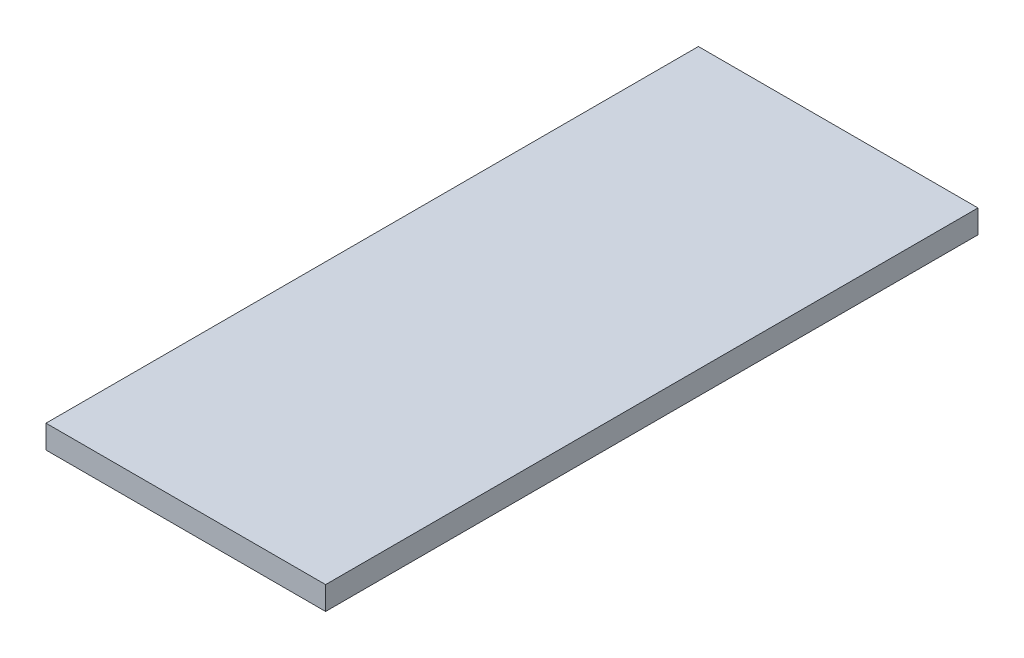
ISO-10303-21;
HEADER;
FILE_DESCRIPTION(('STEP AP214'),'2;1');
FILE_NAME('part.step','',(''),(''),'','','');
FILE_SCHEMA(('AUTOMOTIVE_DESIGN { 1 0 10303 214 1 1 1 1 }'));
ENDSEC;
DATA;
#1=APPLICATION_CONTEXT('core data for automotive mechanical design processes');
#2=APPLICATION_PROTOCOL_DEFINITION('international standard','automotive_design',2000,#1);
#3=PRODUCT_CONTEXT('',#1,'mechanical');
#4=PRODUCT('Part','Part','',(#3));
#5=PRODUCT_RELATED_PRODUCT_CATEGORY('part','',(#4));
#6=PRODUCT_DEFINITION_FORMATION('','',#4);
#7=PRODUCT_DEFINITION_CONTEXT('part definition',#1,'design');
#8=PRODUCT_DEFINITION('design','',#6,#7);
#9=PRODUCT_DEFINITION_SHAPE('','',#8);
#10=(LENGTH_UNIT() NAMED_UNIT(*) SI_UNIT(.MILLI.,.METRE.));
#11=(NAMED_UNIT(*) PLANE_ANGLE_UNIT() SI_UNIT($,.RADIAN.));
#12=(NAMED_UNIT(*) SI_UNIT($,.STERADIAN.) SOLID_ANGLE_UNIT());
#13=UNCERTAINTY_MEASURE_WITH_UNIT(LENGTH_MEASURE(1.E-05),#10,'distance_accuracy_value','');
#14=(GEOMETRIC_REPRESENTATION_CONTEXT(3) GLOBAL_UNCERTAINTY_ASSIGNED_CONTEXT((#13)) GLOBAL_UNIT_ASSIGNED_CONTEXT((#10,
#11,#12)) REPRESENTATION_CONTEXT('',''));
#15=CARTESIAN_POINT('',(0.,0.,0.));
#16=DIRECTION('',(0.,0.,1.));
#17=DIRECTION('',(1.,0.,0.));
#18=AXIS2_PLACEMENT_3D('',#15,#16,#17);
#19=CARTESIAN_POINT('',(0.,25.,0.));
#20=DIRECTION('',(1.,0.,0.));
#21=DIRECTION('',(0.,0.,-1.));
#22=AXIS2_PLACEMENT_3D('',#19,#20,#21);
#23=PLANE('',#22);
#24=DIRECTION('',(0.,0.,1.));
#25=VECTOR('',#24,1.);
#26=CARTESIAN_POINT('',(0.,0.,0.));
#27=LINE('',#26,#25);
#28=CARTESIAN_POINT('',(0.,0.,-700.));
#29=VERTEX_POINT('',#28);
#30=CARTESIAN_POINT('',(0.,0.,0.));
#31=VERTEX_POINT('',#30);
#32=EDGE_CURVE('E96',#29,#31,#27,.T.);
#33=ORIENTED_EDGE('',*,*,#32,.T.);
#34=DIRECTION('',(0.,-1.,0.));
#35=VECTOR('',#34,1.);
#36=CARTESIAN_POINT('',(0.,25.,0.));
#37=LINE('',#36,#35);
#38=CARTESIAN_POINT('',(0.,25.,0.));
#39=VERTEX_POINT('',#38);
#40=EDGE_CURVE('E11',#39,#31,#37,.T.);
#41=ORIENTED_EDGE('',*,*,#40,.F.);
#42=DIRECTION('',(0.,0.,1.));
#43=VECTOR('',#42,1.);
#44=CARTESIAN_POINT('',(0.,25.,0.));
#45=LINE('',#44,#43);
#46=CARTESIAN_POINT('',(0.,25.,-700.));
#47=VERTEX_POINT('',#46);
#48=EDGE_CURVE('E84',#47,#39,#45,.T.);
#49=ORIENTED_EDGE('',*,*,#48,.F.);
#50=DIRECTION('',(0.,-1.,0.));
#51=VECTOR('',#50,1.);
#52=CARTESIAN_POINT('',(0.,25.,-700.));
#53=LINE('',#52,#51);
#54=EDGE_CURVE('E92',#47,#29,#53,.T.);
#55=ORIENTED_EDGE('',*,*,#54,.T.);
#56=EDGE_LOOP('',(#33,#41,#49,#55));
#57=FACE_BOUND('',#56,.T.);
#58=ADVANCED_FACE('F33',(#57),#23,.F.);
#59=CARTESIAN_POINT('',(0.,25.,0.));
#60=DIRECTION('',(0.,0.,-1.));
#61=DIRECTION('',(-1.,0.,0.));
#62=AXIS2_PLACEMENT_3D('',#59,#60,#61);
#63=PLANE('',#62);
#64=DIRECTION('',(1.,0.,0.));
#65=VECTOR('',#64,1.);
#66=CARTESIAN_POINT('',(0.,0.,0.));
#67=LINE('',#66,#65);
#68=CARTESIAN_POINT('',(300.,0.,0.));
#69=VERTEX_POINT('',#68);
#70=EDGE_CURVE('E88',#31,#69,#67,.T.);
#71=ORIENTED_EDGE('',*,*,#70,.T.);
#72=DIRECTION('',(0.,-1.,0.));
#73=VECTOR('',#72,1.);
#74=CARTESIAN_POINT('',(300.,25.,0.));
#75=LINE('',#74,#73);
#76=CARTESIAN_POINT('',(300.,25.,0.));
#77=VERTEX_POINT('',#76);
#78=EDGE_CURVE('E41',#77,#69,#75,.T.);
#79=ORIENTED_EDGE('',*,*,#78,.F.);
#80=DIRECTION('',(1.,0.,0.));
#81=VECTOR('',#80,1.);
#82=CARTESIAN_POINT('',(0.,25.,0.));
#83=LINE('',#82,#81);
#84=EDGE_CURVE('E79',#39,#77,#83,.T.);
#85=ORIENTED_EDGE('',*,*,#84,.F.);
#86=ORIENTED_EDGE('',*,*,#40,.T.);
#87=EDGE_LOOP('',(#71,#79,#85,#86));
#88=FACE_BOUND('',#87,.T.);
#89=ADVANCED_FACE('F87',(#88),#63,.F.);
#90=CARTESIAN_POINT('',(300.,25.,0.));
#91=DIRECTION('',(-1.,0.,0.));
#92=DIRECTION('',(0.,0.,1.));
#93=AXIS2_PLACEMENT_3D('',#90,#91,#92);
#94=PLANE('',#93);
#95=DIRECTION('',(0.,0.,-1.));
#96=VECTOR('',#95,1.);
#97=CARTESIAN_POINT('',(300.,0.,0.));
#98=LINE('',#97,#96);
#99=CARTESIAN_POINT('',(300.,0.,-700.));
#100=VERTEX_POINT('',#99);
#101=EDGE_CURVE('E66',#69,#100,#98,.T.);
#102=ORIENTED_EDGE('',*,*,#101,.T.);
#103=DIRECTION('',(0.,-1.,0.));
#104=VECTOR('',#103,1.);
#105=CARTESIAN_POINT('',(300.,25.,-700.));
#106=LINE('',#105,#104);
#107=CARTESIAN_POINT('',(300.,25.,-700.));
#108=VERTEX_POINT('',#107);
#109=EDGE_CURVE('E89',#108,#100,#106,.T.);
#110=ORIENTED_EDGE('',*,*,#109,.F.);
#111=DIRECTION('',(0.,0.,-1.));
#112=VECTOR('',#111,1.);
#113=CARTESIAN_POINT('',(300.,25.,0.));
#114=LINE('',#113,#112);
#115=EDGE_CURVE('E82',#77,#108,#114,.T.);
#116=ORIENTED_EDGE('',*,*,#115,.F.);
#117=ORIENTED_EDGE('',*,*,#78,.T.);
#118=EDGE_LOOP('',(#102,#110,#116,#117));
#119=FACE_BOUND('',#118,.T.);
#120=ADVANCED_FACE('F90',(#119),#94,.F.);
#121=CARTESIAN_POINT('',(0.,25.,-700.));
#122=DIRECTION('',(0.,0.,1.));
#123=DIRECTION('',(1.,0.,0.));
#124=AXIS2_PLACEMENT_3D('',#121,#122,#123);
#125=PLANE('',#124);
#126=DIRECTION('',(-1.,0.,0.));
#127=VECTOR('',#126,1.);
#128=CARTESIAN_POINT('',(0.,0.,-700.));
#129=LINE('',#128,#127);
#130=EDGE_CURVE('E72',#100,#29,#129,.T.);
#131=ORIENTED_EDGE('',*,*,#130,.T.);
#132=ORIENTED_EDGE('',*,*,#54,.F.);
#133=DIRECTION('',(-1.,0.,0.));
#134=VECTOR('',#133,1.);
#135=CARTESIAN_POINT('',(0.,25.,-700.));
#136=LINE('',#135,#134);
#137=EDGE_CURVE('E49',#108,#47,#136,.T.);
#138=ORIENTED_EDGE('',*,*,#137,.F.);
#139=ORIENTED_EDGE('',*,*,#109,.T.);
#140=EDGE_LOOP('',(#131,#132,#138,#139));
#141=FACE_BOUND('',#140,.T.);
#142=ADVANCED_FACE('F103',(#141),#125,.F.);
#143=CARTESIAN_POINT('',(0.,25.,0.));
#144=DIRECTION('',(0.,-1.,0.));
#145=DIRECTION('',(0.,0.,-1.));
#146=AXIS2_PLACEMENT_3D('',#143,#144,#145);
#147=PLANE('',#146);
#148=ORIENTED_EDGE('',*,*,#48,.T.);
#149=ORIENTED_EDGE('',*,*,#84,.T.);
#150=ORIENTED_EDGE('',*,*,#115,.T.);
#151=ORIENTED_EDGE('',*,*,#137,.T.);
#152=EDGE_LOOP('',(#148,#149,#150,#151));
#153=FACE_BOUND('',#152,.T.);
#154=ADVANCED_FACE('F80',(#153),#147,.F.);
#155=CARTESIAN_POINT('',(0.,0.,0.));
#156=DIRECTION('',(0.,-1.,0.));
#157=DIRECTION('',(0.,0.,-1.));
#158=AXIS2_PLACEMENT_3D('',#155,#156,#157);
#159=PLANE('',#158);
#160=ORIENTED_EDGE('',*,*,#32,.F.);
#161=ORIENTED_EDGE('',*,*,#130,.F.);
#162=ORIENTED_EDGE('',*,*,#101,.F.);
#163=ORIENTED_EDGE('',*,*,#70,.F.);
#164=EDGE_LOOP('',(#160,#161,#162,#163));
#165=FACE_BOUND('',#164,.T.);
#166=ADVANCED_FACE('F106',(#165),#159,.T.);
#167=CLOSED_SHELL('',(#58,#89,#120,#142,#154,#166));
#168=MANIFOLD_SOLID_BREP('B2',#167);
#169=ADVANCED_BREP_SHAPE_REPRESENTATION('',(#18,#168),#14);
#170=SHAPE_DEFINITION_REPRESENTATION(#9,#169);
ENDSEC;
END-ISO-10303-21;
